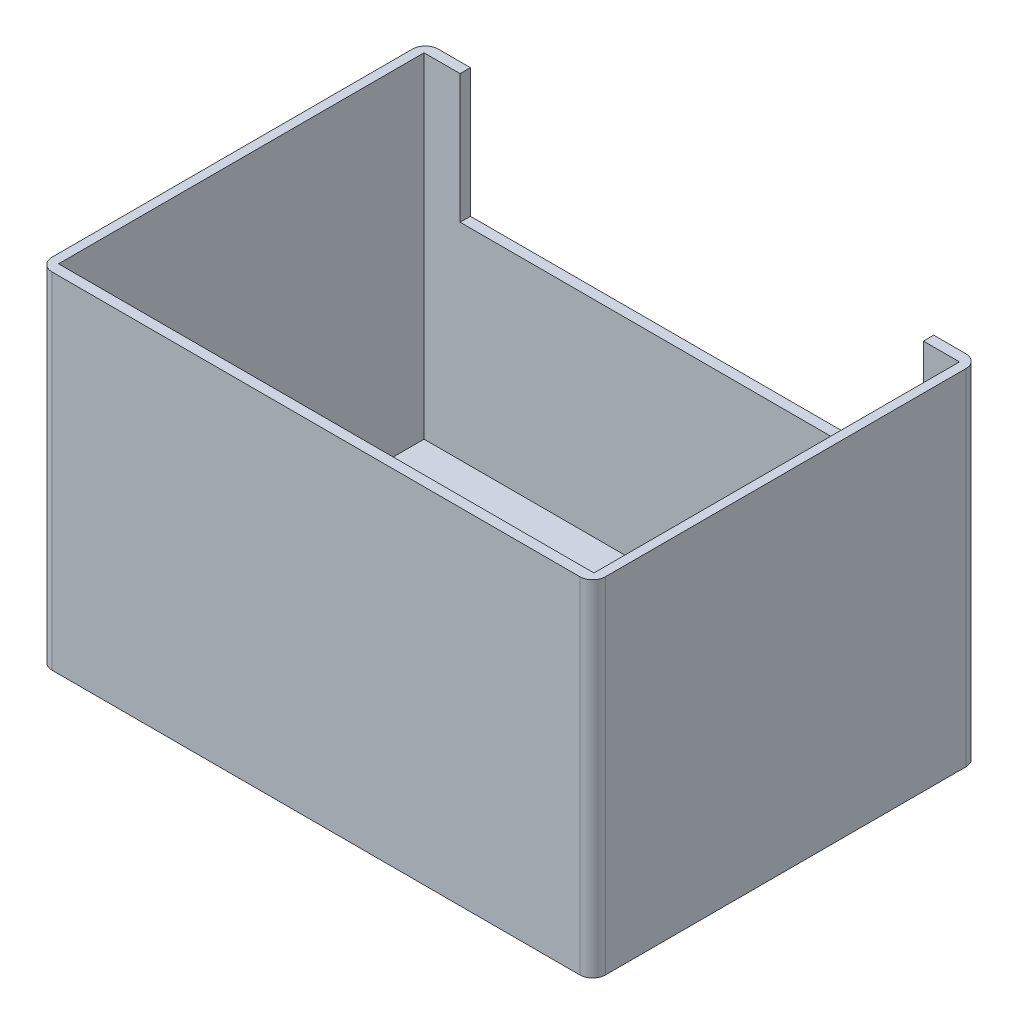
ISO-10303-21;
HEADER;
FILE_DESCRIPTION(('STEP AP214'),'2;1');
FILE_NAME('part.step','',(''),(''),'','','');
FILE_SCHEMA(('AUTOMOTIVE_DESIGN { 1 0 10303 214 1 1 1 1 }'));
ENDSEC;
DATA;
#1=APPLICATION_CONTEXT('core data for automotive mechanical design processes');
#2=APPLICATION_PROTOCOL_DEFINITION('international standard','automotive_design',2000,#1);
#3=PRODUCT_CONTEXT('',#1,'mechanical');
#4=PRODUCT('Part','Part','',(#3));
#5=PRODUCT_RELATED_PRODUCT_CATEGORY('part','',(#4));
#6=PRODUCT_DEFINITION_FORMATION('','',#4);
#7=PRODUCT_DEFINITION_CONTEXT('part definition',#1,'design');
#8=PRODUCT_DEFINITION('design','',#6,#7);
#9=PRODUCT_DEFINITION_SHAPE('','',#8);
#10=(LENGTH_UNIT() NAMED_UNIT(*) SI_UNIT(.MILLI.,.METRE.));
#11=(NAMED_UNIT(*) PLANE_ANGLE_UNIT() SI_UNIT($,.RADIAN.));
#12=(NAMED_UNIT(*) SI_UNIT($,.STERADIAN.) SOLID_ANGLE_UNIT());
#13=UNCERTAINTY_MEASURE_WITH_UNIT(LENGTH_MEASURE(1.E-05),#10,'distance_accuracy_value','');
#14=(GEOMETRIC_REPRESENTATION_CONTEXT(3) GLOBAL_UNCERTAINTY_ASSIGNED_CONTEXT((#13)) GLOBAL_UNIT_ASSIGNED_CONTEXT((#10,
#11,#12)) REPRESENTATION_CONTEXT('',''));
#15=CARTESIAN_POINT('',(0.,0.,0.));
#16=DIRECTION('',(0.,0.,1.));
#17=DIRECTION('',(1.,0.,0.));
#18=AXIS2_PLACEMENT_3D('',#15,#16,#17);
#19=CARTESIAN_POINT('',(-107.5,4.,-80.));
#20=DIRECTION('',(1.,0.,0.));
#21=DIRECTION('',(0.,0.,-1.));
#22=AXIS2_PLACEMENT_3D('',#19,#20,#21);
#23=PLANE('',#22);
#24=DIRECTION('',(0.,0.,1.));
#25=VECTOR('',#24,1.);
#26=CARTESIAN_POINT('',(-107.5,0.,-80.));
#27=LINE('',#26,#25);
#28=CARTESIAN_POINT('',(-107.5,0.,-75.));
#29=VERTEX_POINT('',#28);
#30=CARTESIAN_POINT('',(-107.5,0.,65.));
#31=VERTEX_POINT('',#30);
#32=EDGE_CURVE('E258',#29,#31,#27,.T.);
#33=ORIENTED_EDGE('',*,*,#32,.T.);
#34=DIRECTION('',(0.,-1.,0.));
#35=VECTOR('',#34,1.);
#36=CARTESIAN_POINT('',(-107.5,4.,65.));
#37=LINE('',#36,#35);
#38=CARTESIAN_POINT('',(-107.5,134.,65.));
#39=VERTEX_POINT('',#38);
#40=EDGE_CURVE('E316',#31,#39,#37,.F.);
#41=ORIENTED_EDGE('',*,*,#40,.T.);
#42=DIRECTION('',(0.,0.,1.));
#43=VECTOR('',#42,1.);
#44=CARTESIAN_POINT('',(-107.5,134.,-80.));
#45=LINE('',#44,#43);
#46=CARTESIAN_POINT('',(-107.5,134.,-75.));
#47=VERTEX_POINT('',#46);
#48=EDGE_CURVE('E244',#47,#39,#45,.T.);
#49=ORIENTED_EDGE('',*,*,#48,.F.);
#50=DIRECTION('',(0.,-1.,0.));
#51=VECTOR('',#50,1.);
#52=CARTESIAN_POINT('',(-107.5,4.,-75.));
#53=LINE('',#52,#51);
#54=EDGE_CURVE('E280',#47,#29,#53,.T.);
#55=ORIENTED_EDGE('',*,*,#54,.T.);
#56=EDGE_LOOP('',(#33,#41,#49,#55));
#57=FACE_BOUND('',#56,.T.);
#58=ADVANCED_FACE('F45',(#57),#23,.F.);
#59=CARTESIAN_POINT('',(-107.5,4.,70.));
#60=DIRECTION('',(0.,0.,-1.));
#61=DIRECTION('',(-1.,0.,0.));
#62=AXIS2_PLACEMENT_3D('',#59,#60,#61);
#63=PLANE('',#62);
#64=DIRECTION('',(1.,0.,0.));
#65=VECTOR('',#64,1.);
#66=CARTESIAN_POINT('',(-107.5,0.,70.));
#67=LINE('',#66,#65);
#68=CARTESIAN_POINT('',(-102.5,0.,70.));
#69=VERTEX_POINT('',#68);
#70=CARTESIAN_POINT('',(102.5,0.,70.));
#71=VERTEX_POINT('',#70);
#72=EDGE_CURVE('E262',#69,#71,#67,.T.);
#73=ORIENTED_EDGE('',*,*,#72,.T.);
#74=DIRECTION('',(0.,-1.,0.));
#75=VECTOR('',#74,1.);
#76=CARTESIAN_POINT('',(102.5,4.,70.));
#77=LINE('',#76,#75);
#78=CARTESIAN_POINT('',(102.5,134.,70.));
#79=VERTEX_POINT('',#78);
#80=EDGE_CURVE('E55',#71,#79,#77,.F.);
#81=ORIENTED_EDGE('',*,*,#80,.T.);
#82=DIRECTION('',(1.,0.,0.));
#83=VECTOR('',#82,1.);
#84=CARTESIAN_POINT('',(-107.5,134.,70.));
#85=LINE('',#84,#83);
#86=CARTESIAN_POINT('',(-102.5,134.,70.));
#87=VERTEX_POINT('',#86);
#88=EDGE_CURVE('E248',#87,#79,#85,.T.);
#89=ORIENTED_EDGE('',*,*,#88,.F.);
#90=DIRECTION('',(0.,-1.,0.));
#91=VECTOR('',#90,1.);
#92=CARTESIAN_POINT('',(-102.5,4.,70.));
#93=LINE('',#92,#91);
#94=EDGE_CURVE('E309',#87,#69,#93,.T.);
#95=ORIENTED_EDGE('',*,*,#94,.T.);
#96=EDGE_LOOP('',(#73,#81,#89,#95));
#97=FACE_BOUND('',#96,.T.);
#98=ADVANCED_FACE('F424',(#97),#63,.F.);
#99=CARTESIAN_POINT('',(107.5,4.,-80.));
#100=DIRECTION('',(-1.,0.,0.));
#101=DIRECTION('',(0.,0.,1.));
#102=AXIS2_PLACEMENT_3D('',#99,#100,#101);
#103=PLANE('',#102);
#104=DIRECTION('',(0.,0.,-1.));
#105=VECTOR('',#104,1.);
#106=CARTESIAN_POINT('',(107.5,134.,-80.));
#107=LINE('',#106,#105);
#108=CARTESIAN_POINT('',(107.5,134.,65.));
#109=VERTEX_POINT('',#108);
#110=CARTESIAN_POINT('',(107.5,134.,-75.));
#111=VERTEX_POINT('',#110);
#112=EDGE_CURVE('E251',#109,#111,#107,.T.);
#113=ORIENTED_EDGE('',*,*,#112,.F.);
#114=DIRECTION('',(0.,-1.,0.));
#115=VECTOR('',#114,1.);
#116=CARTESIAN_POINT('',(107.5,4.,65.));
#117=LINE('',#116,#115);
#118=CARTESIAN_POINT('',(107.5,0.,65.));
#119=VERTEX_POINT('',#118);
#120=EDGE_CURVE('E322',#109,#119,#117,.T.);
#121=ORIENTED_EDGE('',*,*,#120,.T.);
#122=DIRECTION('',(0.,0.,-1.));
#123=VECTOR('',#122,1.);
#124=CARTESIAN_POINT('',(107.5,0.,-80.));
#125=LINE('',#124,#123);
#126=CARTESIAN_POINT('',(107.5,0.,-75.));
#127=VERTEX_POINT('',#126);
#128=EDGE_CURVE('E265',#119,#127,#125,.T.);
#129=ORIENTED_EDGE('',*,*,#128,.T.);
#130=DIRECTION('',(0.,-1.,0.));
#131=VECTOR('',#130,1.);
#132=CARTESIAN_POINT('',(107.5,4.,-75.));
#133=LINE('',#132,#131);
#134=EDGE_CURVE('E302',#127,#111,#133,.F.);
#135=ORIENTED_EDGE('',*,*,#134,.T.);
#136=EDGE_LOOP('',(#113,#121,#129,#135));
#137=FACE_BOUND('',#136,.T.);
#138=ADVANCED_FACE('F430',(#137),#103,.F.);
#139=CARTESIAN_POINT('',(-107.5,4.,-80.));
#140=DIRECTION('',(0.,0.,1.));
#141=DIRECTION('',(1.,0.,0.));
#142=AXIS2_PLACEMENT_3D('',#139,#140,#141);
#143=PLANE('',#142);
#144=DIRECTION('',(-1.,0.,0.));
#145=VECTOR('',#144,1.);
#146=CARTESIAN_POINT('',(-107.5,134.,-80.));
#147=LINE('',#146,#145);
#148=CARTESIAN_POINT('',(102.5,134.,-80.));
#149=VERTEX_POINT('',#148);
#150=CARTESIAN_POINT('',(90.,134.,-80.));
#151=VERTEX_POINT('',#150);
#152=EDGE_CURVE('E255',#149,#151,#147,.T.);
#153=ORIENTED_EDGE('',*,*,#152,.F.);
#154=DIRECTION('',(0.,-1.,0.));
#155=VECTOR('',#154,1.);
#156=CARTESIAN_POINT('',(102.5,4.,-80.));
#157=LINE('',#156,#155);
#158=CARTESIAN_POINT('',(102.5,0.,-80.));
#159=VERTEX_POINT('',#158);
#160=EDGE_CURVE('E294',#149,#159,#157,.T.);
#161=ORIENTED_EDGE('',*,*,#160,.T.);
#162=DIRECTION('',(-1.,0.,0.));
#163=VECTOR('',#162,1.);
#164=CARTESIAN_POINT('',(-107.5,0.,-80.));
#165=LINE('',#164,#163);
#166=CARTESIAN_POINT('',(-102.5,0.,-80.));
#167=VERTEX_POINT('',#166);
#168=EDGE_CURVE('E268',#159,#167,#165,.T.);
#169=ORIENTED_EDGE('',*,*,#168,.T.);
#170=DIRECTION('',(0.,-1.,0.));
#171=VECTOR('',#170,1.);
#172=CARTESIAN_POINT('',(-102.5,4.,-80.));
#173=LINE('',#172,#171);
#174=CARTESIAN_POINT('',(-102.5,134.,-80.));
#175=VERTEX_POINT('',#174);
#176=EDGE_CURVE('E288',#167,#175,#173,.F.);
#177=ORIENTED_EDGE('',*,*,#176,.T.);
#178=CARTESIAN_POINT('',(-90.,134.,-80.));
#179=VERTEX_POINT('',#178);
#180=EDGE_CURVE('E254',#179,#175,#147,.T.);
#181=ORIENTED_EDGE('',*,*,#180,.F.);
#182=DIRECTION('',(0.,1.,0.));
#183=VECTOR('',#182,1.);
#184=CARTESIAN_POINT('',(-90.,134.,-80.));
#185=LINE('',#184,#183);
#186=CARTESIAN_POINT('',(-90.,84.,-80.));
#187=VERTEX_POINT('',#186);
#188=EDGE_CURVE('E173',#187,#179,#185,.T.);
#189=ORIENTED_EDGE('',*,*,#188,.F.);
#190=DIRECTION('',(-1.,0.,0.));
#191=VECTOR('',#190,1.);
#192=CARTESIAN_POINT('',(90.,84.,-80.));
#193=LINE('',#192,#191);
#194=CARTESIAN_POINT('',(90.,84.,-80.));
#195=VERTEX_POINT('',#194);
#196=EDGE_CURVE('E165',#195,#187,#193,.T.);
#197=ORIENTED_EDGE('',*,*,#196,.F.);
#198=DIRECTION('',(0.,-1.,0.));
#199=VECTOR('',#198,1.);
#200=CARTESIAN_POINT('',(90.,134.,-80.));
#201=LINE('',#200,#199);
#202=EDGE_CURVE('E177',#151,#195,#201,.T.);
#203=ORIENTED_EDGE('',*,*,#202,.F.);
#204=EDGE_LOOP('',(#153,#161,#169,#177,#181,#189,#197,#203));
#205=FACE_BOUND('',#204,.T.);
#206=ADVANCED_FACE('F185',(#205),#143,.F.);
#207=CARTESIAN_POINT('',(0.,0.,0.));
#208=DIRECTION('',(0.,1.,0.));
#209=DIRECTION('',(0.,0.,1.));
#210=AXIS2_PLACEMENT_3D('',#207,#208,#209);
#211=PLANE('',#210);
#212=CARTESIAN_POINT('',(-15.,0.,-20.));
#213=DIRECTION('',(0.,-1.,0.));
#214=DIRECTION('',(0.,0.,-1.));
#215=AXIS2_PLACEMENT_3D('',#212,#213,#214);
#216=CIRCLE('',#215,2.25);
#217=CARTESIAN_POINT('',(-15.,0.,-22.25));
#218=VERTEX_POINT('',#217);
#219=EDGE_CURVE('E520',#218,#218,#216,.T.);
#220=ORIENTED_EDGE('',*,*,#219,.F.);
#221=EDGE_LOOP('',(#220));
#222=FACE_BOUND('',#221,.T.);
#223=CARTESIAN_POINT('',(15.,0.,20.));
#224=DIRECTION('',(0.,-1.,0.));
#225=DIRECTION('',(0.,0.,-1.));
#226=AXIS2_PLACEMENT_3D('',#223,#224,#225);
#227=CIRCLE('',#226,2.25);
#228=CARTESIAN_POINT('',(15.,0.,17.75));
#229=VERTEX_POINT('',#228);
#230=EDGE_CURVE('E522',#229,#229,#227,.T.);
#231=ORIENTED_EDGE('',*,*,#230,.F.);
#232=EDGE_LOOP('',(#231));
#233=FACE_BOUND('',#232,.T.);
#234=CARTESIAN_POINT('',(-15.,0.,0.));
#235=DIRECTION('',(0.,-1.,0.));
#236=DIRECTION('',(0.,0.,-1.));
#237=AXIS2_PLACEMENT_3D('',#234,#235,#236);
#238=CIRCLE('',#237,2.25);
#239=CARTESIAN_POINT('',(-15.,0.,-2.25));
#240=VERTEX_POINT('',#239);
#241=EDGE_CURVE('E526',#240,#240,#238,.T.);
#242=ORIENTED_EDGE('',*,*,#241,.F.);
#243=EDGE_LOOP('',(#242));
#244=FACE_BOUND('',#243,.T.);
#245=CARTESIAN_POINT('',(15.,0.,40.));
#246=DIRECTION('',(0.,-1.,0.));
#247=DIRECTION('',(0.,0.,-1.));
#248=AXIS2_PLACEMENT_3D('',#245,#246,#247);
#249=CIRCLE('',#248,2.25);
#250=CARTESIAN_POINT('',(15.,0.,37.75));
#251=VERTEX_POINT('',#250);
#252=EDGE_CURVE('E530',#251,#251,#249,.T.);
#253=ORIENTED_EDGE('',*,*,#252,.F.);
#254=EDGE_LOOP('',(#253));
#255=FACE_BOUND('',#254,.T.);
#256=CARTESIAN_POINT('',(15.,0.,0.));
#257=DIRECTION('',(0.,-1.,0.));
#258=DIRECTION('',(0.,0.,-1.));
#259=AXIS2_PLACEMENT_3D('',#256,#257,#258);
#260=CIRCLE('',#259,2.25);
#261=CARTESIAN_POINT('',(15.,0.,-2.25));
#262=VERTEX_POINT('',#261);
#263=EDGE_CURVE('E508',#262,#262,#260,.T.);
#264=ORIENTED_EDGE('',*,*,#263,.F.);
#265=EDGE_LOOP('',(#264));
#266=FACE_BOUND('',#265,.T.);
#267=CARTESIAN_POINT('',(-15.,0.,40.));
#268=DIRECTION('',(0.,-1.,0.));
#269=DIRECTION('',(0.,0.,-1.));
#270=AXIS2_PLACEMENT_3D('',#267,#268,#269);
#271=CIRCLE('',#270,2.25);
#272=CARTESIAN_POINT('',(-15.,0.,37.75));
#273=VERTEX_POINT('',#272);
#274=EDGE_CURVE('E511',#273,#273,#271,.T.);
#275=ORIENTED_EDGE('',*,*,#274,.F.);
#276=EDGE_LOOP('',(#275));
#277=FACE_BOUND('',#276,.T.);
#278=CARTESIAN_POINT('',(15.,0.,-20.));
#279=DIRECTION('',(0.,-1.,0.));
#280=DIRECTION('',(0.,0.,-1.));
#281=AXIS2_PLACEMENT_3D('',#278,#279,#280);
#282=CIRCLE('',#281,2.25);
#283=CARTESIAN_POINT('',(15.,0.,-22.25));
#284=VERTEX_POINT('',#283);
#285=EDGE_CURVE('E515',#284,#284,#282,.T.);
#286=ORIENTED_EDGE('',*,*,#285,.F.);
#287=EDGE_LOOP('',(#286));
#288=FACE_BOUND('',#287,.T.);
#289=CARTESIAN_POINT('',(-15.,0.,20.));
#290=DIRECTION('',(0.,-1.,0.));
#291=DIRECTION('',(0.,0.,-1.));
#292=AXIS2_PLACEMENT_3D('',#289,#290,#291);
#293=CIRCLE('',#292,2.25);
#294=CARTESIAN_POINT('',(-15.,0.,17.75));
#295=VERTEX_POINT('',#294);
#296=EDGE_CURVE('E335',#295,#295,#293,.T.);
#297=ORIENTED_EDGE('',*,*,#296,.F.);
#298=EDGE_LOOP('',(#297));
#299=FACE_BOUND('',#298,.T.);
#300=ORIENTED_EDGE('',*,*,#128,.F.);
#301=CARTESIAN_POINT('',(102.5,0.,65.));
#302=DIRECTION('',(0.,1.,0.));
#303=DIRECTION('',(0.,0.,1.));
#304=AXIS2_PLACEMENT_3D('',#301,#302,#303);
#305=CIRCLE('',#304,5.);
#306=EDGE_CURVE('E70',#119,#71,#305,.F.);
#307=ORIENTED_EDGE('',*,*,#306,.T.);
#308=ORIENTED_EDGE('',*,*,#72,.F.);
#309=CARTESIAN_POINT('',(-102.5,0.,65.));
#310=DIRECTION('',(0.,1.,0.));
#311=DIRECTION('',(0.,0.,1.));
#312=AXIS2_PLACEMENT_3D('',#309,#310,#311);
#313=CIRCLE('',#312,5.);
#314=EDGE_CURVE('E313',#69,#31,#313,.F.);
#315=ORIENTED_EDGE('',*,*,#314,.T.);
#316=ORIENTED_EDGE('',*,*,#32,.F.);
#317=CARTESIAN_POINT('',(-102.5,0.,-75.));
#318=DIRECTION('',(0.,1.,0.));
#319=DIRECTION('',(0.,0.,1.));
#320=AXIS2_PLACEMENT_3D('',#317,#318,#319);
#321=CIRCLE('',#320,5.);
#322=EDGE_CURVE('E284',#29,#167,#321,.F.);
#323=ORIENTED_EDGE('',*,*,#322,.T.);
#324=ORIENTED_EDGE('',*,*,#168,.F.);
#325=CARTESIAN_POINT('',(102.5,0.,-75.));
#326=DIRECTION('',(0.,1.,0.));
#327=DIRECTION('',(0.,0.,1.));
#328=AXIS2_PLACEMENT_3D('',#325,#326,#327);
#329=CIRCLE('',#328,5.);
#330=EDGE_CURVE('E298',#159,#127,#329,.F.);
#331=ORIENTED_EDGE('',*,*,#330,.T.);
#332=EDGE_LOOP('',(#300,#307,#308,#315,#316,#323,#324,#331));
#333=FACE_BOUND('',#332,.T.);
#334=ADVANCED_FACE('F418',(#222,#233,#244,#255,#266,#277,#288,#299,#333),#211,.F.);
#335=CARTESIAN_POINT('',(0.,134.,0.));
#336=DIRECTION('',(0.,1.,0.));
#337=DIRECTION('',(0.,0.,1.));
#338=AXIS2_PLACEMENT_3D('',#335,#336,#337);
#339=PLANE('',#338);
#340=ORIENTED_EDGE('',*,*,#88,.T.);
#341=CARTESIAN_POINT('',(102.5,134.,65.));
#342=DIRECTION('',(0.,1.,0.));
#343=DIRECTION('',(0.,0.,1.));
#344=AXIS2_PLACEMENT_3D('',#341,#342,#343);
#345=CIRCLE('',#344,5.);
#346=EDGE_CURVE('E11',#79,#109,#345,.T.);
#347=ORIENTED_EDGE('',*,*,#346,.T.);
#348=ORIENTED_EDGE('',*,*,#112,.T.);
#349=CARTESIAN_POINT('',(102.5,134.,-75.));
#350=DIRECTION('',(0.,1.,0.));
#351=DIRECTION('',(0.,0.,1.));
#352=AXIS2_PLACEMENT_3D('',#349,#350,#351);
#353=CIRCLE('',#352,5.);
#354=EDGE_CURVE('E306',#111,#149,#353,.T.);
#355=ORIENTED_EDGE('',*,*,#354,.T.);
#356=ORIENTED_EDGE('',*,*,#152,.T.);
#357=DIRECTION('',(0.,0.,-1.));
#358=VECTOR('',#357,1.);
#359=CARTESIAN_POINT('',(90.,134.,-74.));
#360=LINE('',#359,#358);
#361=CARTESIAN_POINT('',(90.,134.,-76.));
#362=VERTEX_POINT('',#361);
#363=EDGE_CURVE('E180',#362,#151,#360,.T.);
#364=ORIENTED_EDGE('',*,*,#363,.F.);
#365=DIRECTION('',(-1.,0.,0.));
#366=VECTOR('',#365,1.);
#367=CARTESIAN_POINT('',(-104.,134.,-76.));
#368=LINE('',#367,#366);
#369=CARTESIAN_POINT('',(104.,134.,-76.));
#370=VERTEX_POINT('',#369);
#371=EDGE_CURVE('E214',#370,#362,#368,.T.);
#372=ORIENTED_EDGE('',*,*,#371,.F.);
#373=DIRECTION('',(0.,0.,-1.));
#374=VECTOR('',#373,1.);
#375=CARTESIAN_POINT('',(104.,134.,-76.));
#376=LINE('',#375,#374);
#377=CARTESIAN_POINT('',(104.,134.,66.));
#378=VERTEX_POINT('',#377);
#379=EDGE_CURVE('E209',#378,#370,#376,.T.);
#380=ORIENTED_EDGE('',*,*,#379,.F.);
#381=DIRECTION('',(1.,0.,0.));
#382=VECTOR('',#381,1.);
#383=CARTESIAN_POINT('',(-104.,134.,66.));
#384=LINE('',#383,#382);
#385=CARTESIAN_POINT('',(-104.,134.,66.));
#386=VERTEX_POINT('',#385);
#387=EDGE_CURVE('E205',#386,#378,#384,.T.);
#388=ORIENTED_EDGE('',*,*,#387,.F.);
#389=DIRECTION('',(0.,0.,1.));
#390=VECTOR('',#389,1.);
#391=CARTESIAN_POINT('',(-104.,134.,-76.));
#392=LINE('',#391,#390);
#393=CARTESIAN_POINT('',(-104.,134.,-76.));
#394=VERTEX_POINT('',#393);
#395=EDGE_CURVE('E202',#394,#386,#392,.T.);
#396=ORIENTED_EDGE('',*,*,#395,.F.);
#397=CARTESIAN_POINT('',(-90.,134.,-76.));
#398=VERTEX_POINT('',#397);
#399=EDGE_CURVE('E213',#398,#394,#368,.T.);
#400=ORIENTED_EDGE('',*,*,#399,.F.);
#401=DIRECTION('',(0.,0.,-1.));
#402=VECTOR('',#401,1.);
#403=CARTESIAN_POINT('',(-90.,134.,-74.));
#404=LINE('',#403,#402);
#405=EDGE_CURVE('E196',#398,#179,#404,.T.);
#406=ORIENTED_EDGE('',*,*,#405,.T.);
#407=ORIENTED_EDGE('',*,*,#180,.T.);
#408=CARTESIAN_POINT('',(-102.5,134.,-75.));
#409=DIRECTION('',(0.,1.,0.));
#410=DIRECTION('',(0.,0.,1.));
#411=AXIS2_PLACEMENT_3D('',#408,#409,#410);
#412=CIRCLE('',#411,5.);
#413=EDGE_CURVE('E291',#175,#47,#412,.T.);
#414=ORIENTED_EDGE('',*,*,#413,.T.);
#415=ORIENTED_EDGE('',*,*,#48,.T.);
#416=CARTESIAN_POINT('',(-102.5,134.,65.));
#417=DIRECTION('',(0.,1.,0.));
#418=DIRECTION('',(0.,0.,1.));
#419=AXIS2_PLACEMENT_3D('',#416,#417,#418);
#420=CIRCLE('',#419,5.);
#421=EDGE_CURVE('E319',#39,#87,#420,.T.);
#422=ORIENTED_EDGE('',*,*,#421,.T.);
#423=EDGE_LOOP('',(#340,#347,#348,#355,#356,#364,#372,#380,#388,#396,#400,#406,#407,#414,#415,#422));
#424=FACE_BOUND('',#423,.T.);
#425=ADVANCED_FACE('F399',(#424),#339,.T.);
#426=CARTESIAN_POINT('',(-104.,134.,-76.));
#427=DIRECTION('',(1.,0.,0.));
#428=DIRECTION('',(0.,0.,-1.));
#429=AXIS2_PLACEMENT_3D('',#426,#427,#428);
#430=PLANE('',#429);
#431=DIRECTION('',(0.,0.,1.));
#432=VECTOR('',#431,1.);
#433=CARTESIAN_POINT('',(-104.,4.,-76.));
#434=LINE('',#433,#432);
#435=CARTESIAN_POINT('',(-104.,4.,-76.));
#436=VERTEX_POINT('',#435);
#437=CARTESIAN_POINT('',(-104.,4.,66.));
#438=VERTEX_POINT('',#437);
#439=EDGE_CURVE('E195',#436,#438,#434,.T.);
#440=ORIENTED_EDGE('',*,*,#439,.F.);
#441=DIRECTION('',(0.,-1.,0.));
#442=VECTOR('',#441,1.);
#443=CARTESIAN_POINT('',(-104.,134.,-76.));
#444=LINE('',#443,#442);
#445=EDGE_CURVE('E218',#394,#436,#444,.T.);
#446=ORIENTED_EDGE('',*,*,#445,.F.);
#447=ORIENTED_EDGE('',*,*,#395,.T.);
#448=DIRECTION('',(0.,-1.,0.));
#449=VECTOR('',#448,1.);
#450=CARTESIAN_POINT('',(-104.,134.,66.));
#451=LINE('',#450,#449);
#452=EDGE_CURVE('E240',#386,#438,#451,.T.);
#453=ORIENTED_EDGE('',*,*,#452,.T.);
#454=EDGE_LOOP('',(#440,#446,#447,#453));
#455=FACE_BOUND('',#454,.T.);
#456=ADVANCED_FACE('F395',(#455),#430,.T.);
#457=CARTESIAN_POINT('',(-104.,134.,66.));
#458=DIRECTION('',(0.,0.,-1.));
#459=DIRECTION('',(-1.,0.,0.));
#460=AXIS2_PLACEMENT_3D('',#457,#458,#459);
#461=PLANE('',#460);
#462=DIRECTION('',(1.,0.,0.));
#463=VECTOR('',#462,1.);
#464=CARTESIAN_POINT('',(-104.,4.,66.));
#465=LINE('',#464,#463);
#466=CARTESIAN_POINT('',(104.,4.,66.));
#467=VERTEX_POINT('',#466);
#468=EDGE_CURVE('E221',#438,#467,#465,.T.);
#469=ORIENTED_EDGE('',*,*,#468,.F.);
#470=ORIENTED_EDGE('',*,*,#452,.F.);
#471=ORIENTED_EDGE('',*,*,#387,.T.);
#472=DIRECTION('',(0.,-1.,0.));
#473=VECTOR('',#472,1.);
#474=CARTESIAN_POINT('',(104.,134.,66.));
#475=LINE('',#474,#473);
#476=EDGE_CURVE('E236',#378,#467,#475,.T.);
#477=ORIENTED_EDGE('',*,*,#476,.T.);
#478=EDGE_LOOP('',(#469,#470,#471,#477));
#479=FACE_BOUND('',#478,.T.);
#480=ADVANCED_FACE('F391',(#479),#461,.T.);
#481=CARTESIAN_POINT('',(104.,134.,-76.));
#482=DIRECTION('',(-1.,0.,0.));
#483=DIRECTION('',(0.,0.,1.));
#484=AXIS2_PLACEMENT_3D('',#481,#482,#483);
#485=PLANE('',#484);
#486=DIRECTION('',(0.,0.,-1.));
#487=VECTOR('',#486,1.);
#488=CARTESIAN_POINT('',(104.,4.,-76.));
#489=LINE('',#488,#487);
#490=CARTESIAN_POINT('',(104.,4.,-76.));
#491=VERTEX_POINT('',#490);
#492=EDGE_CURVE('E224',#467,#491,#489,.T.);
#493=ORIENTED_EDGE('',*,*,#492,.F.);
#494=ORIENTED_EDGE('',*,*,#476,.F.);
#495=ORIENTED_EDGE('',*,*,#379,.T.);
#496=DIRECTION('',(0.,-1.,0.));
#497=VECTOR('',#496,1.);
#498=CARTESIAN_POINT('',(104.,134.,-76.));
#499=LINE('',#498,#497);
#500=EDGE_CURVE('E232',#370,#491,#499,.T.);
#501=ORIENTED_EDGE('',*,*,#500,.T.);
#502=EDGE_LOOP('',(#493,#494,#495,#501));
#503=FACE_BOUND('',#502,.T.);
#504=ADVANCED_FACE('F403',(#503),#485,.T.);
#505=CARTESIAN_POINT('',(-104.,134.,-76.));
#506=DIRECTION('',(0.,0.,1.));
#507=DIRECTION('',(1.,0.,0.));
#508=AXIS2_PLACEMENT_3D('',#505,#506,#507);
#509=PLANE('',#508);
#510=DIRECTION('',(0.,1.,0.));
#511=VECTOR('',#510,1.);
#512=CARTESIAN_POINT('',(90.,134.,-76.));
#513=LINE('',#512,#511);
#514=CARTESIAN_POINT('',(90.,84.,-76.));
#515=VERTEX_POINT('',#514);
#516=EDGE_CURVE('E277',#515,#362,#513,.T.);
#517=ORIENTED_EDGE('',*,*,#516,.F.);
#518=DIRECTION('',(1.,0.,0.));
#519=VECTOR('',#518,1.);
#520=CARTESIAN_POINT('',(-104.,84.,-76.));
#521=LINE('',#520,#519);
#522=CARTESIAN_POINT('',(-90.,84.,-76.));
#523=VERTEX_POINT('',#522);
#524=EDGE_CURVE('E168',#523,#515,#521,.T.);
#525=ORIENTED_EDGE('',*,*,#524,.F.);
#526=DIRECTION('',(0.,-1.,0.));
#527=VECTOR('',#526,1.);
#528=CARTESIAN_POINT('',(-90.,134.,-76.));
#529=LINE('',#528,#527);
#530=EDGE_CURVE('E273',#398,#523,#529,.T.);
#531=ORIENTED_EDGE('',*,*,#530,.F.);
#532=ORIENTED_EDGE('',*,*,#399,.T.);
#533=ORIENTED_EDGE('',*,*,#445,.T.);
#534=DIRECTION('',(-1.,0.,0.));
#535=VECTOR('',#534,1.);
#536=CARTESIAN_POINT('',(-104.,4.,-76.));
#537=LINE('',#536,#535);
#538=EDGE_CURVE('E206',#491,#436,#537,.T.);
#539=ORIENTED_EDGE('',*,*,#538,.F.);
#540=ORIENTED_EDGE('',*,*,#500,.F.);
#541=ORIENTED_EDGE('',*,*,#371,.T.);
#542=EDGE_LOOP('',(#517,#525,#531,#532,#533,#539,#540,#541));
#543=FACE_BOUND('',#542,.T.);
#544=ADVANCED_FACE('F369',(#543),#509,.T.);
#545=CARTESIAN_POINT('',(0.,4.,0.));
#546=DIRECTION('',(0.,1.,0.));
#547=DIRECTION('',(0.,0.,1.));
#548=AXIS2_PLACEMENT_3D('',#545,#546,#547);
#549=PLANE('',#548);
#550=CARTESIAN_POINT('',(-15.,4.,-20.));
#551=DIRECTION('',(0.,1.,0.));
#552=DIRECTION('',(0.,0.,1.));
#553=AXIS2_PLACEMENT_3D('',#550,#551,#552);
#554=CIRCLE('',#553,2.25);
#555=CARTESIAN_POINT('',(-15.,4.,-17.75));
#556=VERTEX_POINT('',#555);
#557=EDGE_CURVE('E49',#556,#556,#554,.T.);
#558=ORIENTED_EDGE('',*,*,#557,.F.);
#559=EDGE_LOOP('',(#558));
#560=FACE_BOUND('',#559,.T.);
#561=CARTESIAN_POINT('',(15.,4.,20.));
#562=DIRECTION('',(0.,1.,0.));
#563=DIRECTION('',(0.,0.,1.));
#564=AXIS2_PLACEMENT_3D('',#561,#562,#563);
#565=CIRCLE('',#564,2.25);
#566=CARTESIAN_POINT('',(15.,4.,22.25));
#567=VERTEX_POINT('',#566);
#568=EDGE_CURVE('E354',#567,#567,#565,.T.);
#569=ORIENTED_EDGE('',*,*,#568,.F.);
#570=EDGE_LOOP('',(#569));
#571=FACE_BOUND('',#570,.T.);
#572=CARTESIAN_POINT('',(-15.,4.,0.));
#573=DIRECTION('',(0.,1.,0.));
#574=DIRECTION('',(0.,0.,1.));
#575=AXIS2_PLACEMENT_3D('',#572,#573,#574);
#576=CIRCLE('',#575,2.25);
#577=CARTESIAN_POINT('',(-15.,4.,2.25));
#578=VERTEX_POINT('',#577);
#579=EDGE_CURVE('E351',#578,#578,#576,.T.);
#580=ORIENTED_EDGE('',*,*,#579,.F.);
#581=EDGE_LOOP('',(#580));
#582=FACE_BOUND('',#581,.T.);
#583=CARTESIAN_POINT('',(15.,4.,40.));
#584=DIRECTION('',(0.,1.,0.));
#585=DIRECTION('',(0.,0.,1.));
#586=AXIS2_PLACEMENT_3D('',#583,#584,#585);
#587=CIRCLE('',#586,2.25);
#588=CARTESIAN_POINT('',(15.,4.,42.25));
#589=VERTEX_POINT('',#588);
#590=EDGE_CURVE('E347',#589,#589,#587,.T.);
#591=ORIENTED_EDGE('',*,*,#590,.F.);
#592=EDGE_LOOP('',(#591));
#593=FACE_BOUND('',#592,.T.);
#594=CARTESIAN_POINT('',(15.,4.,0.));
#595=DIRECTION('',(0.,1.,0.));
#596=DIRECTION('',(0.,0.,1.));
#597=AXIS2_PLACEMENT_3D('',#594,#595,#596);
#598=CIRCLE('',#597,2.25);
#599=CARTESIAN_POINT('',(15.,4.,2.25));
#600=VERTEX_POINT('',#599);
#601=EDGE_CURVE('E343',#600,#600,#598,.T.);
#602=ORIENTED_EDGE('',*,*,#601,.F.);
#603=EDGE_LOOP('',(#602));
#604=FACE_BOUND('',#603,.T.);
#605=CARTESIAN_POINT('',(-15.,4.,40.));
#606=DIRECTION('',(0.,1.,0.));
#607=DIRECTION('',(0.,0.,1.));
#608=AXIS2_PLACEMENT_3D('',#605,#606,#607);
#609=CIRCLE('',#608,2.25);
#610=CARTESIAN_POINT('',(-15.,4.,42.25));
#611=VERTEX_POINT('',#610);
#612=EDGE_CURVE('E339',#611,#611,#609,.T.);
#613=ORIENTED_EDGE('',*,*,#612,.F.);
#614=EDGE_LOOP('',(#613));
#615=FACE_BOUND('',#614,.T.);
#616=CARTESIAN_POINT('',(15.,4.,-20.));
#617=DIRECTION('',(0.,1.,0.));
#618=DIRECTION('',(0.,0.,1.));
#619=AXIS2_PLACEMENT_3D('',#616,#617,#618);
#620=CIRCLE('',#619,2.25);
#621=CARTESIAN_POINT('',(15.,4.,-17.75));
#622=VERTEX_POINT('',#621);
#623=EDGE_CURVE('E334',#622,#622,#620,.T.);
#624=ORIENTED_EDGE('',*,*,#623,.F.);
#625=EDGE_LOOP('',(#624));
#626=FACE_BOUND('',#625,.T.);
#627=CARTESIAN_POINT('',(-15.,4.,20.));
#628=DIRECTION('',(0.,1.,0.));
#629=DIRECTION('',(0.,0.,1.));
#630=AXIS2_PLACEMENT_3D('',#627,#628,#629);
#631=CIRCLE('',#630,2.25);
#632=CARTESIAN_POINT('',(-15.,4.,22.25));
#633=VERTEX_POINT('',#632);
#634=EDGE_CURVE('E330',#633,#633,#631,.T.);
#635=ORIENTED_EDGE('',*,*,#634,.F.);
#636=EDGE_LOOP('',(#635));
#637=FACE_BOUND('',#636,.T.);
#638=ORIENTED_EDGE('',*,*,#439,.T.);
#639=ORIENTED_EDGE('',*,*,#468,.T.);
#640=ORIENTED_EDGE('',*,*,#492,.T.);
#641=ORIENTED_EDGE('',*,*,#538,.T.);
#642=EDGE_LOOP('',(#638,#639,#640,#641));
#643=FACE_BOUND('',#642,.T.);
#644=ADVANCED_FACE('F366',(#560,#571,#582,#593,#604,#615,#626,#637,#643),#549,.T.);
#645=CARTESIAN_POINT('',(90.,134.,-74.));
#646=DIRECTION('',(1.,0.,0.));
#647=DIRECTION('',(0.,0.,-1.));
#648=AXIS2_PLACEMENT_3D('',#645,#646,#647);
#649=PLANE('',#648);
#650=ORIENTED_EDGE('',*,*,#516,.T.);
#651=ORIENTED_EDGE('',*,*,#363,.T.);
#652=ORIENTED_EDGE('',*,*,#202,.T.);
#653=DIRECTION('',(0.,0.,-1.));
#654=VECTOR('',#653,1.);
#655=CARTESIAN_POINT('',(90.,84.,-74.));
#656=LINE('',#655,#654);
#657=EDGE_CURVE('E161',#515,#195,#656,.T.);
#658=ORIENTED_EDGE('',*,*,#657,.F.);
#659=EDGE_LOOP('',(#650,#651,#652,#658));
#660=FACE_BOUND('',#659,.T.);
#661=ADVANCED_FACE('F178',(#660),#649,.F.);
#662=CARTESIAN_POINT('',(-90.,134.,-74.));
#663=DIRECTION('',(-1.,0.,0.));
#664=DIRECTION('',(0.,0.,1.));
#665=AXIS2_PLACEMENT_3D('',#662,#663,#664);
#666=PLANE('',#665);
#667=ORIENTED_EDGE('',*,*,#530,.T.);
#668=DIRECTION('',(0.,0.,-1.));
#669=VECTOR('',#668,1.);
#670=CARTESIAN_POINT('',(-90.,84.,-74.));
#671=LINE('',#670,#669);
#672=EDGE_CURVE('E172',#523,#187,#671,.T.);
#673=ORIENTED_EDGE('',*,*,#672,.T.);
#674=ORIENTED_EDGE('',*,*,#188,.T.);
#675=ORIENTED_EDGE('',*,*,#405,.F.);
#676=EDGE_LOOP('',(#667,#673,#674,#675));
#677=FACE_BOUND('',#676,.T.);
#678=ADVANCED_FACE('F469',(#677),#666,.F.);
#679=CARTESIAN_POINT('',(90.,84.,-74.));
#680=DIRECTION('',(0.,-1.,0.));
#681=DIRECTION('',(1.,0.,0.));
#682=AXIS2_PLACEMENT_3D('',#679,#680,#681);
#683=PLANE('',#682);
#684=ORIENTED_EDGE('',*,*,#524,.T.);
#685=ORIENTED_EDGE('',*,*,#657,.T.);
#686=ORIENTED_EDGE('',*,*,#196,.T.);
#687=ORIENTED_EDGE('',*,*,#672,.F.);
#688=EDGE_LOOP('',(#684,#685,#686,#687));
#689=FACE_BOUND('',#688,.T.);
#690=ADVANCED_FACE('F163',(#689),#683,.F.);
#691=CARTESIAN_POINT('',(-102.5,4.,-75.));
#692=DIRECTION('',(0.,-1.,0.));
#693=DIRECTION('',(0.,0.,-1.));
#694=AXIS2_PLACEMENT_3D('',#691,#692,#693);
#695=CYLINDRICAL_SURFACE('',#694,5.);
#696=ORIENTED_EDGE('',*,*,#413,.F.);
#697=ORIENTED_EDGE('',*,*,#176,.F.);
#698=ORIENTED_EDGE('',*,*,#322,.F.);
#699=ORIENTED_EDGE('',*,*,#54,.F.);
#700=EDGE_LOOP('',(#696,#697,#698,#699));
#701=FACE_BOUND('',#700,.T.);
#702=ADVANCED_FACE('F414',(#701),#695,.T.);
#703=CARTESIAN_POINT('',(102.5,4.,-75.));
#704=DIRECTION('',(0.,-1.,0.));
#705=DIRECTION('',(0.,0.,-1.));
#706=AXIS2_PLACEMENT_3D('',#703,#704,#705);
#707=CYLINDRICAL_SURFACE('',#706,5.);
#708=ORIENTED_EDGE('',*,*,#354,.F.);
#709=ORIENTED_EDGE('',*,*,#134,.F.);
#710=ORIENTED_EDGE('',*,*,#330,.F.);
#711=ORIENTED_EDGE('',*,*,#160,.F.);
#712=EDGE_LOOP('',(#708,#709,#710,#711));
#713=FACE_BOUND('',#712,.T.);
#714=ADVANCED_FACE('F435',(#713),#707,.T.);
#715=CARTESIAN_POINT('',(-102.5,4.,65.));
#716=DIRECTION('',(0.,-1.,0.));
#717=DIRECTION('',(0.,0.,-1.));
#718=AXIS2_PLACEMENT_3D('',#715,#716,#717);
#719=CYLINDRICAL_SURFACE('',#718,5.);
#720=ORIENTED_EDGE('',*,*,#421,.F.);
#721=ORIENTED_EDGE('',*,*,#40,.F.);
#722=ORIENTED_EDGE('',*,*,#314,.F.);
#723=ORIENTED_EDGE('',*,*,#94,.F.);
#724=EDGE_LOOP('',(#720,#721,#722,#723));
#725=FACE_BOUND('',#724,.T.);
#726=ADVANCED_FACE('F423',(#725),#719,.T.);
#727=CARTESIAN_POINT('',(102.5,4.,65.));
#728=DIRECTION('',(0.,-1.,0.));
#729=DIRECTION('',(0.,0.,-1.));
#730=AXIS2_PLACEMENT_3D('',#727,#728,#729);
#731=CYLINDRICAL_SURFACE('',#730,5.);
#732=ORIENTED_EDGE('',*,*,#346,.F.);
#733=ORIENTED_EDGE('',*,*,#80,.F.);
#734=ORIENTED_EDGE('',*,*,#306,.F.);
#735=ORIENTED_EDGE('',*,*,#120,.F.);
#736=EDGE_LOOP('',(#732,#733,#734,#735));
#737=FACE_BOUND('',#736,.T.);
#738=ADVANCED_FACE('F47',(#737),#731,.T.);
#739=CARTESIAN_POINT('',(-15.,6.,20.));
#740=DIRECTION('',(0.,-1.,0.));
#741=DIRECTION('',(0.,0.,-1.));
#742=AXIS2_PLACEMENT_3D('',#739,#740,#741);
#743=CYLINDRICAL_SURFACE('',#742,2.25);
#744=ORIENTED_EDGE('',*,*,#634,.T.);
#745=EDGE_LOOP('',(#744));
#746=FACE_BOUND('',#745,.T.);
#747=ORIENTED_EDGE('',*,*,#296,.T.);
#748=EDGE_LOOP('',(#747));
#749=FACE_BOUND('',#748,.T.);
#750=ADVANCED_FACE('F475',(#746,#749),#743,.F.);
#751=CARTESIAN_POINT('',(15.,6.,-20.));
#752=DIRECTION('',(0.,-1.,0.));
#753=DIRECTION('',(0.,0.,-1.));
#754=AXIS2_PLACEMENT_3D('',#751,#752,#753);
#755=CYLINDRICAL_SURFACE('',#754,2.25);
#756=ORIENTED_EDGE('',*,*,#623,.T.);
#757=EDGE_LOOP('',(#756));
#758=FACE_BOUND('',#757,.T.);
#759=ORIENTED_EDGE('',*,*,#285,.T.);
#760=EDGE_LOOP('',(#759));
#761=FACE_BOUND('',#760,.T.);
#762=ADVANCED_FACE('F478',(#758,#761),#755,.F.);
#763=CARTESIAN_POINT('',(-15.,6.,40.));
#764=DIRECTION('',(0.,-1.,0.));
#765=DIRECTION('',(0.,0.,-1.));
#766=AXIS2_PLACEMENT_3D('',#763,#764,#765);
#767=CYLINDRICAL_SURFACE('',#766,2.25);
#768=ORIENTED_EDGE('',*,*,#612,.T.);
#769=EDGE_LOOP('',(#768));
#770=FACE_BOUND('',#769,.T.);
#771=ORIENTED_EDGE('',*,*,#274,.T.);
#772=EDGE_LOOP('',(#771));
#773=FACE_BOUND('',#772,.T.);
#774=ADVANCED_FACE('F494',(#770,#773),#767,.F.);
#775=CARTESIAN_POINT('',(15.,6.,0.));
#776=DIRECTION('',(0.,-1.,0.));
#777=DIRECTION('',(0.,0.,-1.));
#778=AXIS2_PLACEMENT_3D('',#775,#776,#777);
#779=CYLINDRICAL_SURFACE('',#778,2.25);
#780=ORIENTED_EDGE('',*,*,#601,.T.);
#781=EDGE_LOOP('',(#780));
#782=FACE_BOUND('',#781,.T.);
#783=ORIENTED_EDGE('',*,*,#263,.T.);
#784=EDGE_LOOP('',(#783));
#785=FACE_BOUND('',#784,.T.);
#786=ADVANCED_FACE('F488',(#782,#785),#779,.F.);
#787=CARTESIAN_POINT('',(15.,6.,40.));
#788=DIRECTION('',(0.,-1.,0.));
#789=DIRECTION('',(0.,0.,-1.));
#790=AXIS2_PLACEMENT_3D('',#787,#788,#789);
#791=CYLINDRICAL_SURFACE('',#790,2.25);
#792=ORIENTED_EDGE('',*,*,#590,.T.);
#793=EDGE_LOOP('',(#792));
#794=FACE_BOUND('',#793,.T.);
#795=ORIENTED_EDGE('',*,*,#252,.T.);
#796=EDGE_LOOP('',(#795));
#797=FACE_BOUND('',#796,.T.);
#798=ADVANCED_FACE('F484',(#794,#797),#791,.F.);
#799=CARTESIAN_POINT('',(-15.,6.,0.));
#800=DIRECTION('',(0.,-1.,0.));
#801=DIRECTION('',(0.,0.,-1.));
#802=AXIS2_PLACEMENT_3D('',#799,#800,#801);
#803=CYLINDRICAL_SURFACE('',#802,2.25);
#804=ORIENTED_EDGE('',*,*,#579,.T.);
#805=EDGE_LOOP('',(#804));
#806=FACE_BOUND('',#805,.T.);
#807=ORIENTED_EDGE('',*,*,#241,.T.);
#808=EDGE_LOOP('',(#807));
#809=FACE_BOUND('',#808,.T.);
#810=ADVANCED_FACE('F480',(#806,#809),#803,.F.);
#811=CARTESIAN_POINT('',(15.,6.,20.));
#812=DIRECTION('',(0.,-1.,0.));
#813=DIRECTION('',(0.,0.,-1.));
#814=AXIS2_PLACEMENT_3D('',#811,#812,#813);
#815=CYLINDRICAL_SURFACE('',#814,2.25);
#816=ORIENTED_EDGE('',*,*,#568,.T.);
#817=EDGE_LOOP('',(#816));
#818=FACE_BOUND('',#817,.T.);
#819=ORIENTED_EDGE('',*,*,#230,.T.);
#820=EDGE_LOOP('',(#819));
#821=FACE_BOUND('',#820,.T.);
#822=ADVANCED_FACE('F483',(#818,#821),#815,.F.);
#823=CARTESIAN_POINT('',(-15.,6.,-20.));
#824=DIRECTION('',(0.,-1.,0.));
#825=DIRECTION('',(0.,0.,-1.));
#826=AXIS2_PLACEMENT_3D('',#823,#824,#825);
#827=CYLINDRICAL_SURFACE('',#826,2.25);
#828=ORIENTED_EDGE('',*,*,#557,.T.);
#829=EDGE_LOOP('',(#828));
#830=FACE_BOUND('',#829,.T.);
#831=ORIENTED_EDGE('',*,*,#219,.T.);
#832=EDGE_LOOP('',(#831));
#833=FACE_BOUND('',#832,.T.);
#834=ADVANCED_FACE('F363',(#830,#833),#827,.F.);
#835=CLOSED_SHELL('',(#58,#98,#138,#206,#334,#425,#456,#480,#504,#544,#644,#661,#678,#690,#702,
#714,#726,#738,#750,#762,#774,#786,#798,#810,#822,#834));
#836=MANIFOLD_SOLID_BREP('B2',#835);
#837=ADVANCED_BREP_SHAPE_REPRESENTATION('',(#18,#836),#14);
#838=SHAPE_DEFINITION_REPRESENTATION(#9,#837);
ENDSEC;
END-ISO-10303-21;
